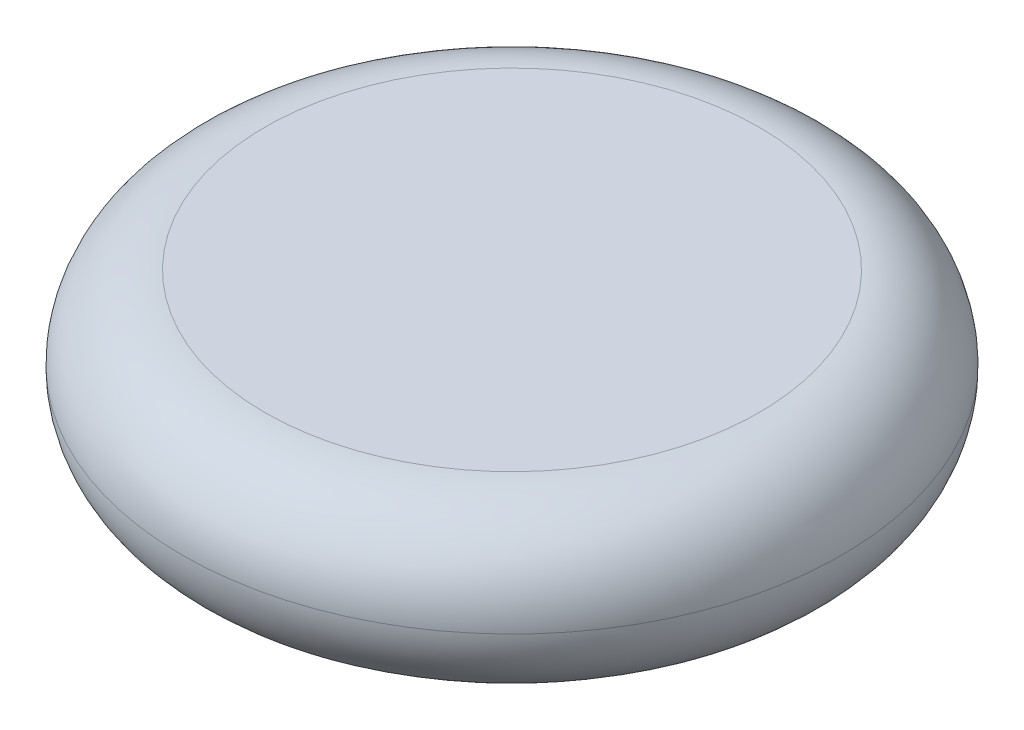
ISO-10303-21;
HEADER;
FILE_DESCRIPTION(('STEP AP214'),'2;1');
FILE_NAME('part.step','',(''),(''),'','','');
FILE_SCHEMA(('AUTOMOTIVE_DESIGN { 1 0 10303 214 1 1 1 1 }'));
ENDSEC;
DATA;
#1=APPLICATION_CONTEXT('core data for automotive mechanical design processes');
#2=APPLICATION_PROTOCOL_DEFINITION('international standard','automotive_design',2000,#1);
#3=PRODUCT_CONTEXT('',#1,'mechanical');
#4=PRODUCT('Part','Part','',(#3));
#5=PRODUCT_RELATED_PRODUCT_CATEGORY('part','',(#4));
#6=PRODUCT_DEFINITION_FORMATION('','',#4);
#7=PRODUCT_DEFINITION_CONTEXT('part definition',#1,'design');
#8=PRODUCT_DEFINITION('design','',#6,#7);
#9=PRODUCT_DEFINITION_SHAPE('','',#8);
#10=(LENGTH_UNIT() NAMED_UNIT(*) SI_UNIT(.MILLI.,.METRE.));
#11=(NAMED_UNIT(*) PLANE_ANGLE_UNIT() SI_UNIT($,.RADIAN.));
#12=(NAMED_UNIT(*) SI_UNIT($,.STERADIAN.) SOLID_ANGLE_UNIT());
#13=UNCERTAINTY_MEASURE_WITH_UNIT(LENGTH_MEASURE(1.E-05),#10,'distance_accuracy_value','');
#14=(GEOMETRIC_REPRESENTATION_CONTEXT(3) GLOBAL_UNCERTAINTY_ASSIGNED_CONTEXT((#13)) GLOBAL_UNIT_ASSIGNED_CONTEXT((#10,
#11,#12)) REPRESENTATION_CONTEXT('',''));
#15=CARTESIAN_POINT('',(0.,0.,0.));
#16=DIRECTION('',(0.,0.,1.));
#17=DIRECTION('',(1.,0.,0.));
#18=AXIS2_PLACEMENT_3D('',#15,#16,#17);
#19=CARTESIAN_POINT('',(0.,-50.8,0.));
#20=DIRECTION('',(0.,1.,0.));
#21=DIRECTION('',(0.,0.,1.));
#22=AXIS2_PLACEMENT_3D('',#19,#20,#21);
#23=PLANE('',#22);
#24=CARTESIAN_POINT('',(0.,-50.8,0.));
#25=DIRECTION('',(0.,1.,0.));
#26=DIRECTION('',(0.,0.,1.));
#27=AXIS2_PLACEMENT_3D('',#24,#25,#26);
#28=CIRCLE('',#27,152.4);
#29=CARTESIAN_POINT('',(0.,-50.8,152.4));
#30=VERTEX_POINT('',#29);
#31=EDGE_CURVE('E46',#30,#30,#28,.F.);
#32=ORIENTED_EDGE('',*,*,#31,.T.);
#33=EDGE_LOOP('',(#32));
#34=FACE_BOUND('',#33,.T.);
#35=ADVANCED_FACE('F37',(#34),#23,.F.);
#36=CARTESIAN_POINT('',(0.,50.8,0.));
#37=DIRECTION('',(0.,1.,0.));
#38=DIRECTION('',(0.,0.,1.));
#39=AXIS2_PLACEMENT_3D('',#36,#37,#38);
#40=PLANE('',#39);
#41=CARTESIAN_POINT('',(0.,50.8,0.));
#42=DIRECTION('',(0.,1.,0.));
#43=DIRECTION('',(0.,0.,1.));
#44=AXIS2_PLACEMENT_3D('',#41,#42,#43);
#45=CIRCLE('',#44,152.4);
#46=CARTESIAN_POINT('',(0.,50.8,152.4));
#47=VERTEX_POINT('',#46);
#48=EDGE_CURVE('E10',#47,#47,#45,.T.);
#49=ORIENTED_EDGE('',*,*,#48,.T.);
#50=EDGE_LOOP('',(#49));
#51=FACE_BOUND('',#50,.T.);
#52=ADVANCED_FACE('F61',(#51),#40,.T.);
#53=CARTESIAN_POINT('',(0.,0.,0.));
#54=DIRECTION('',(0.,1.,0.));
#55=DIRECTION('',(0.,0.,1.));
#56=AXIS2_PLACEMENT_3D('',#53,#54,#55);
#57=TOROIDAL_SURFACE('',#56,152.4,50.8);
#58=ORIENTED_EDGE('',*,*,#48,.F.);
#59=EDGE_LOOP('',(#58));
#60=FACE_BOUND('',#59,.T.);
#61=CARTESIAN_POINT('',(0.,0.,0.));
#62=DIRECTION('',(0.,1.,0.));
#63=DIRECTION('',(0.,0.,1.));
#64=AXIS2_PLACEMENT_3D('',#61,#62,#63);
#65=CIRCLE('',#64,203.2);
#66=CARTESIAN_POINT('',(0.,0.,203.2));
#67=VERTEX_POINT('',#66);
#68=EDGE_CURVE('E41',#67,#67,#65,.F.);
#69=ORIENTED_EDGE('',*,*,#68,.F.);
#70=EDGE_LOOP('',(#69));
#71=FACE_BOUND('',#70,.T.);
#72=ADVANCED_FACE('F39',(#60,#71),#57,.T.);
#73=CARTESIAN_POINT('',(0.,0.,0.));
#74=DIRECTION('',(0.,1.,0.));
#75=DIRECTION('',(0.,0.,1.));
#76=AXIS2_PLACEMENT_3D('',#73,#74,#75);
#77=TOROIDAL_SURFACE('',#76,152.4,50.8);
#78=ORIENTED_EDGE('',*,*,#31,.F.);
#79=EDGE_LOOP('',(#78));
#80=FACE_BOUND('',#79,.T.);
#81=ORIENTED_EDGE('',*,*,#68,.T.);
#82=EDGE_LOOP('',(#81));
#83=FACE_BOUND('',#82,.T.);
#84=ADVANCED_FACE('F58',(#80,#83),#77,.T.);
#85=CLOSED_SHELL('',(#35,#52,#72,#84));
#86=MANIFOLD_SOLID_BREP('B2',#85);
#87=ADVANCED_BREP_SHAPE_REPRESENTATION('',(#18,#86),#14);
#88=SHAPE_DEFINITION_REPRESENTATION(#9,#87);
ENDSEC;
END-ISO-10303-21;
